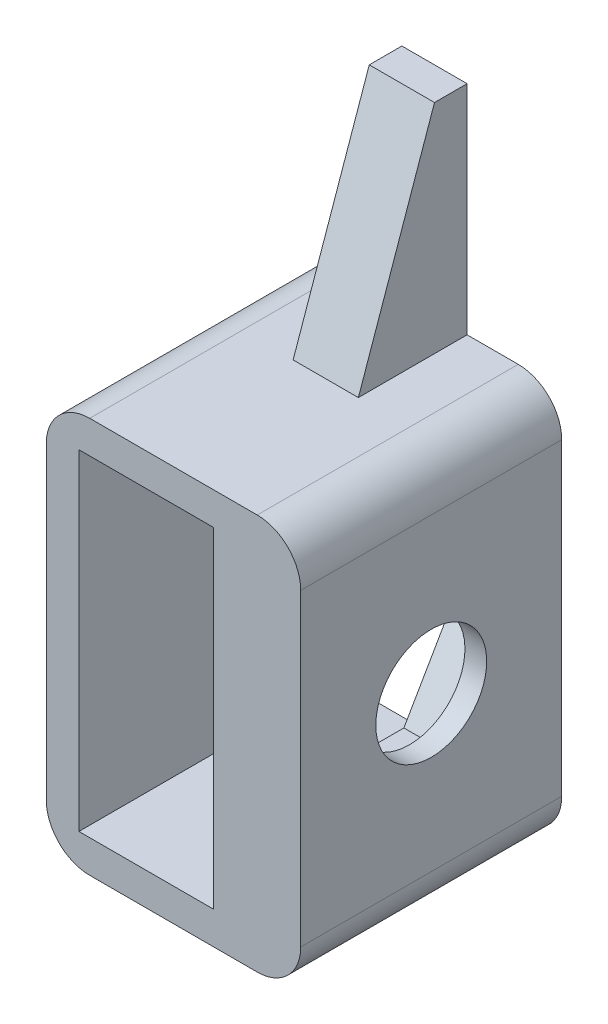
ISO-10303-21;
HEADER;
FILE_DESCRIPTION(('STEP AP214'),'2;1');
FILE_NAME('part.step','',(''),(''),'','','');
FILE_SCHEMA(('AUTOMOTIVE_DESIGN { 1 0 10303 214 1 1 1 1 }'));
ENDSEC;
DATA;
#1=APPLICATION_CONTEXT('core data for automotive mechanical design processes');
#2=APPLICATION_PROTOCOL_DEFINITION('international standard','automotive_design',2000,#1);
#3=PRODUCT_CONTEXT('',#1,'mechanical');
#4=PRODUCT('Part','Part','',(#3));
#5=PRODUCT_RELATED_PRODUCT_CATEGORY('part','',(#4));
#6=PRODUCT_DEFINITION_FORMATION('','',#4);
#7=PRODUCT_DEFINITION_CONTEXT('part definition',#1,'design');
#8=PRODUCT_DEFINITION('design','',#6,#7);
#9=PRODUCT_DEFINITION_SHAPE('','',#8);
#10=(LENGTH_UNIT() NAMED_UNIT(*) SI_UNIT(.MILLI.,.METRE.));
#11=(NAMED_UNIT(*) PLANE_ANGLE_UNIT() SI_UNIT($,.RADIAN.));
#12=(NAMED_UNIT(*) SI_UNIT($,.STERADIAN.) SOLID_ANGLE_UNIT());
#13=UNCERTAINTY_MEASURE_WITH_UNIT(LENGTH_MEASURE(1.E-05),#10,'distance_accuracy_value','');
#14=(GEOMETRIC_REPRESENTATION_CONTEXT(3) GLOBAL_UNCERTAINTY_ASSIGNED_CONTEXT((#13)) GLOBAL_UNIT_ASSIGNED_CONTEXT((#10,
#11,#12)) REPRESENTATION_CONTEXT('',''));
#15=CARTESIAN_POINT('',(0.,0.,0.));
#16=DIRECTION('',(0.,0.,1.));
#17=DIRECTION('',(1.,0.,0.));
#18=AXIS2_PLACEMENT_3D('',#15,#16,#17);
#19=CARTESIAN_POINT('',(-4.6,9.1,-12.));
#20=DIRECTION('',(0.,-1.,0.));
#21=DIRECTION('',(1.,0.,0.));
#22=AXIS2_PLACEMENT_3D('',#19,#20,#21);
#23=PLANE('',#22);
#24=DIRECTION('',(1.,0.,0.));
#25=VECTOR('',#24,1.);
#26=CARTESIAN_POINT('',(-4.6,9.1,-7.));
#27=LINE('',#26,#25);
#28=CARTESIAN_POINT('',(-0.250000000000001,9.1,-7.));
#29=VERTEX_POINT('',#28);
#30=CARTESIAN_POINT('',(2.75,9.1,-7.));
#31=VERTEX_POINT('',#30);
#32=EDGE_CURVE('E193',#29,#31,#27,.T.);
#33=ORIENTED_EDGE('',*,*,#32,.F.);
#34=DIRECTION('',(0.,0.,-1.));
#35=VECTOR('',#34,1.);
#36=CARTESIAN_POINT('',(-0.250000000000001,9.1,-12.));
#37=LINE('',#36,#35);
#38=CARTESIAN_POINT('',(-0.250000000000001,9.1,-12.));
#39=VERTEX_POINT('',#38);
#40=EDGE_CURVE('E200',#29,#39,#37,.T.);
#41=ORIENTED_EDGE('',*,*,#40,.T.);
#42=DIRECTION('',(-1.,0.,0.));
#43=VECTOR('',#42,1.);
#44=CARTESIAN_POINT('',(-4.6,9.1,-12.));
#45=LINE('',#44,#43);
#46=CARTESIAN_POINT('',(-2.6,9.1,-12.));
#47=VERTEX_POINT('',#46);
#48=EDGE_CURVE('E319',#39,#47,#45,.T.);
#49=ORIENTED_EDGE('',*,*,#48,.T.);
#50=DIRECTION('',(0.,0.,1.));
#51=VECTOR('',#50,1.);
#52=CARTESIAN_POINT('',(-2.6,9.1,-12.));
#53=LINE('',#52,#51);
#54=CARTESIAN_POINT('',(-2.6,9.1,0.));
#55=VERTEX_POINT('',#54);
#56=EDGE_CURVE('E45',#55,#47,#53,.F.);
#57=ORIENTED_EDGE('',*,*,#56,.F.);
#58=DIRECTION('',(-1.,0.,0.));
#59=VECTOR('',#58,1.);
#60=CARTESIAN_POINT('',(-4.6,9.1,0.));
#61=LINE('',#60,#59);
#62=CARTESIAN_POINT('',(5.1,9.1,0.));
#63=VERTEX_POINT('',#62);
#64=EDGE_CURVE('E313',#63,#55,#61,.T.);
#65=ORIENTED_EDGE('',*,*,#64,.F.);
#66=DIRECTION('',(0.,0.,1.));
#67=VECTOR('',#66,1.);
#68=CARTESIAN_POINT('',(5.1,9.1,-12.));
#69=LINE('',#68,#67);
#70=CARTESIAN_POINT('',(5.1,9.1,-12.));
#71=VERTEX_POINT('',#70);
#72=EDGE_CURVE('E11',#71,#63,#69,.T.);
#73=ORIENTED_EDGE('',*,*,#72,.F.);
#74=CARTESIAN_POINT('',(2.75,9.1,-12.));
#75=VERTEX_POINT('',#74);
#76=EDGE_CURVE('E320',#71,#75,#45,.T.);
#77=ORIENTED_EDGE('',*,*,#76,.T.);
#78=DIRECTION('',(0.,0.,1.));
#79=VECTOR('',#78,1.);
#80=CARTESIAN_POINT('',(2.75,9.1,-12.));
#81=LINE('',#80,#79);
#82=EDGE_CURVE('E207',#75,#31,#81,.T.);
#83=ORIENTED_EDGE('',*,*,#82,.T.);
#84=EDGE_LOOP('',(#33,#41,#49,#57,#65,#73,#77,#83));
#85=FACE_BOUND('',#84,.T.);
#86=ADVANCED_FACE('F37',(#85),#23,.F.);
#87=CARTESIAN_POINT('',(0.,0.,-12.));
#88=DIRECTION('',(0.,0.,-1.));
#89=DIRECTION('',(1.,0.,0.));
#90=AXIS2_PLACEMENT_3D('',#87,#88,#89);
#91=PLANE('',#90);
#92=DIRECTION('',(0.,1.,0.));
#93=VECTOR('',#92,1.);
#94=CARTESIAN_POINT('',(3.1,-7.6,-12.));
#95=LINE('',#94,#93);
#96=CARTESIAN_POINT('',(3.1,-7.6,-12.));
#97=VERTEX_POINT('',#96);
#98=CARTESIAN_POINT('',(3.1,7.6,-12.));
#99=VERTEX_POINT('',#98);
#100=EDGE_CURVE('E277',#97,#99,#95,.T.);
#101=ORIENTED_EDGE('',*,*,#100,.T.);
#102=DIRECTION('',(-1.,0.,0.));
#103=VECTOR('',#102,1.);
#104=CARTESIAN_POINT('',(-3.1,7.6,-12.));
#105=LINE('',#104,#103);
#106=CARTESIAN_POINT('',(-3.1,7.6,-12.));
#107=VERTEX_POINT('',#106);
#108=EDGE_CURVE('E280',#99,#107,#105,.T.);
#109=ORIENTED_EDGE('',*,*,#108,.T.);
#110=DIRECTION('',(0.,-1.,0.));
#111=VECTOR('',#110,1.);
#112=CARTESIAN_POINT('',(-3.1,-7.6,-12.));
#113=LINE('',#112,#111);
#114=CARTESIAN_POINT('',(-3.1,-7.6,-12.));
#115=VERTEX_POINT('',#114);
#116=EDGE_CURVE('E284',#107,#115,#113,.T.);
#117=ORIENTED_EDGE('',*,*,#116,.T.);
#118=DIRECTION('',(1.,0.,0.));
#119=VECTOR('',#118,1.);
#120=CARTESIAN_POINT('',(-3.1,-7.6,-12.));
#121=LINE('',#120,#119);
#122=EDGE_CURVE('E287',#115,#97,#121,.T.);
#123=ORIENTED_EDGE('',*,*,#122,.T.);
#124=EDGE_LOOP('',(#101,#109,#117,#123));
#125=FACE_BOUND('',#124,.T.);
#126=DIRECTION('',(1.,0.,0.));
#127=VECTOR('',#126,1.);
#128=CARTESIAN_POINT('',(-4.6,-9.1,-12.));
#129=LINE('',#128,#127);
#130=CARTESIAN_POINT('',(-2.6,-9.1,-12.));
#131=VERTEX_POINT('',#130);
#132=CARTESIAN_POINT('',(5.1,-9.1,-12.));
#133=VERTEX_POINT('',#132);
#134=EDGE_CURVE('E312',#131,#133,#129,.T.);
#135=ORIENTED_EDGE('',*,*,#134,.F.);
#136=CARTESIAN_POINT('',(-2.6,-7.1,-12.));
#137=DIRECTION('',(0.,0.,1.));
#138=DIRECTION('',(1.,0.,0.));
#139=AXIS2_PLACEMENT_3D('',#136,#137,#138);
#140=CIRCLE('',#139,2.);
#141=CARTESIAN_POINT('',(-4.6,-7.1,-12.));
#142=VERTEX_POINT('',#141);
#143=EDGE_CURVE('E356',#142,#131,#140,.T.);
#144=ORIENTED_EDGE('',*,*,#143,.F.);
#145=DIRECTION('',(0.,-1.,0.));
#146=VECTOR('',#145,1.);
#147=CARTESIAN_POINT('',(-4.6,9.1,-12.));
#148=LINE('',#147,#146);
#149=CARTESIAN_POINT('',(-4.6,7.1,-12.));
#150=VERTEX_POINT('',#149);
#151=EDGE_CURVE('E309',#150,#142,#148,.T.);
#152=ORIENTED_EDGE('',*,*,#151,.F.);
#153=CARTESIAN_POINT('',(-2.6,7.1,-12.));
#154=DIRECTION('',(0.,0.,1.));
#155=DIRECTION('',(1.,0.,0.));
#156=AXIS2_PLACEMENT_3D('',#153,#154,#155);
#157=CIRCLE('',#156,2.);
#158=EDGE_CURVE('E52',#47,#150,#157,.T.);
#159=ORIENTED_EDGE('',*,*,#158,.F.);
#160=ORIENTED_EDGE('',*,*,#48,.F.);
#161=DIRECTION('',(0.,-1.,0.));
#162=VECTOR('',#161,1.);
#163=CARTESIAN_POINT('',(-0.250000000000004,19.1,-12.));
#164=LINE('',#163,#162);
#165=CARTESIAN_POINT('',(-0.250000000000004,19.1,-12.));
#166=VERTEX_POINT('',#165);
#167=EDGE_CURVE('E203',#166,#39,#164,.T.);
#168=ORIENTED_EDGE('',*,*,#167,.F.);
#169=DIRECTION('',(1.,0.,0.));
#170=VECTOR('',#169,1.);
#171=CARTESIAN_POINT('',(2.75,19.1,-12.));
#172=LINE('',#171,#170);
#173=CARTESIAN_POINT('',(2.75,19.1,-12.));
#174=VERTEX_POINT('',#173);
#175=EDGE_CURVE('E221',#166,#174,#172,.T.);
#176=ORIENTED_EDGE('',*,*,#175,.T.);
#177=DIRECTION('',(0.,-1.,0.));
#178=VECTOR('',#177,1.);
#179=CARTESIAN_POINT('',(2.75,19.1,-12.));
#180=LINE('',#179,#178);
#181=EDGE_CURVE('E223',#174,#75,#180,.T.);
#182=ORIENTED_EDGE('',*,*,#181,.T.);
#183=ORIENTED_EDGE('',*,*,#76,.F.);
#184=CARTESIAN_POINT('',(5.1,7.1,-12.));
#185=DIRECTION('',(0.,0.,1.));
#186=DIRECTION('',(1.,0.,0.));
#187=AXIS2_PLACEMENT_3D('',#184,#185,#186);
#188=CIRCLE('',#187,2.);
#189=CARTESIAN_POINT('',(7.1,7.1,-12.));
#190=VERTEX_POINT('',#189);
#191=EDGE_CURVE('E59',#190,#71,#188,.T.);
#192=ORIENTED_EDGE('',*,*,#191,.F.);
#193=DIRECTION('',(0.,1.,0.));
#194=VECTOR('',#193,1.);
#195=CARTESIAN_POINT('',(7.1,9.1,-12.));
#196=LINE('',#195,#194);
#197=CARTESIAN_POINT('',(7.1,-7.1,-12.));
#198=VERTEX_POINT('',#197);
#199=EDGE_CURVE('E316',#198,#190,#196,.T.);
#200=ORIENTED_EDGE('',*,*,#199,.F.);
#201=CARTESIAN_POINT('',(5.1,-7.1,-12.));
#202=DIRECTION('',(0.,0.,1.));
#203=DIRECTION('',(1.,0.,0.));
#204=AXIS2_PLACEMENT_3D('',#201,#202,#203);
#205=CIRCLE('',#204,2.);
#206=EDGE_CURVE('E353',#133,#198,#205,.T.);
#207=ORIENTED_EDGE('',*,*,#206,.F.);
#208=EDGE_LOOP('',(#135,#144,#152,#159,#160,#168,#176,#182,#183,#192,#200,#207));
#209=FACE_BOUND('',#208,.T.);
#210=ADVANCED_FACE('F367',(#125,#209),#91,.T.);
#211=CARTESIAN_POINT('',(0.,0.,0.));
#212=DIRECTION('',(0.,0.,-1.));
#213=DIRECTION('',(1.,0.,0.));
#214=AXIS2_PLACEMENT_3D('',#211,#212,#213);
#215=PLANE('',#214);
#216=DIRECTION('',(1.,0.,0.));
#217=VECTOR('',#216,1.);
#218=CARTESIAN_POINT('',(-4.6,-9.1,0.));
#219=LINE('',#218,#217);
#220=CARTESIAN_POINT('',(-2.6,-9.1,0.));
#221=VERTEX_POINT('',#220);
#222=CARTESIAN_POINT('',(5.1,-9.1,0.));
#223=VERTEX_POINT('',#222);
#224=EDGE_CURVE('E325',#221,#223,#219,.T.);
#225=ORIENTED_EDGE('',*,*,#224,.T.);
#226=CARTESIAN_POINT('',(5.1,-7.1,0.));
#227=DIRECTION('',(0.,0.,1.));
#228=DIRECTION('',(1.,0.,0.));
#229=AXIS2_PLACEMENT_3D('',#226,#227,#228);
#230=CIRCLE('',#229,2.);
#231=CARTESIAN_POINT('',(7.1,-7.1,0.));
#232=VERTEX_POINT('',#231);
#233=EDGE_CURVE('E341',#232,#223,#230,.F.);
#234=ORIENTED_EDGE('',*,*,#233,.F.);
#235=DIRECTION('',(0.,1.,0.));
#236=VECTOR('',#235,1.);
#237=CARTESIAN_POINT('',(7.1,9.1,0.));
#238=LINE('',#237,#236);
#239=CARTESIAN_POINT('',(7.1,7.1,0.));
#240=VERTEX_POINT('',#239);
#241=EDGE_CURVE('E328',#232,#240,#238,.T.);
#242=ORIENTED_EDGE('',*,*,#241,.T.);
#243=CARTESIAN_POINT('',(5.1,7.1,0.));
#244=DIRECTION('',(0.,0.,1.));
#245=DIRECTION('',(1.,0.,0.));
#246=AXIS2_PLACEMENT_3D('',#243,#244,#245);
#247=CIRCLE('',#246,2.);
#248=EDGE_CURVE('E338',#63,#240,#247,.F.);
#249=ORIENTED_EDGE('',*,*,#248,.F.);
#250=ORIENTED_EDGE('',*,*,#64,.T.);
#251=CARTESIAN_POINT('',(-2.6,7.1,0.));
#252=DIRECTION('',(0.,0.,1.));
#253=DIRECTION('',(1.,0.,0.));
#254=AXIS2_PLACEMENT_3D('',#251,#252,#253);
#255=CIRCLE('',#254,2.);
#256=CARTESIAN_POINT('',(-4.6,7.1,0.));
#257=VERTEX_POINT('',#256);
#258=EDGE_CURVE('E336',#257,#55,#255,.F.);
#259=ORIENTED_EDGE('',*,*,#258,.F.);
#260=DIRECTION('',(0.,-1.,0.));
#261=VECTOR('',#260,1.);
#262=CARTESIAN_POINT('',(-4.6,9.1,0.));
#263=LINE('',#262,#261);
#264=CARTESIAN_POINT('',(-4.6,-7.1,0.));
#265=VERTEX_POINT('',#264);
#266=EDGE_CURVE('E308',#257,#265,#263,.T.);
#267=ORIENTED_EDGE('',*,*,#266,.T.);
#268=CARTESIAN_POINT('',(-2.6,-7.1,0.));
#269=DIRECTION('',(0.,0.,1.));
#270=DIRECTION('',(1.,0.,0.));
#271=AXIS2_PLACEMENT_3D('',#268,#269,#270);
#272=CIRCLE('',#271,2.);
#273=EDGE_CURVE('E344',#221,#265,#272,.F.);
#274=ORIENTED_EDGE('',*,*,#273,.F.);
#275=EDGE_LOOP('',(#225,#234,#242,#249,#250,#259,#267,#274));
#276=FACE_BOUND('',#275,.T.);
#277=DIRECTION('',(0.,1.,0.));
#278=VECTOR('',#277,1.);
#279=CARTESIAN_POINT('',(3.1,-7.6,0.));
#280=LINE('',#279,#278);
#281=CARTESIAN_POINT('',(3.1,-7.6,0.));
#282=VERTEX_POINT('',#281);
#283=CARTESIAN_POINT('',(3.1,7.6,0.));
#284=VERTEX_POINT('',#283);
#285=EDGE_CURVE('E267',#282,#284,#280,.T.);
#286=ORIENTED_EDGE('',*,*,#285,.F.);
#287=DIRECTION('',(1.,0.,0.));
#288=VECTOR('',#287,1.);
#289=CARTESIAN_POINT('',(-3.1,-7.6,0.));
#290=LINE('',#289,#288);
#291=CARTESIAN_POINT('',(-3.1,-7.6,0.));
#292=VERTEX_POINT('',#291);
#293=EDGE_CURVE('E281',#292,#282,#290,.T.);
#294=ORIENTED_EDGE('',*,*,#293,.F.);
#295=DIRECTION('',(0.,-1.,0.));
#296=VECTOR('',#295,1.);
#297=CARTESIAN_POINT('',(-3.1,-7.6,0.));
#298=LINE('',#297,#296);
#299=CARTESIAN_POINT('',(-3.1,7.6,0.));
#300=VERTEX_POINT('',#299);
#301=EDGE_CURVE('E296',#300,#292,#298,.T.);
#302=ORIENTED_EDGE('',*,*,#301,.F.);
#303=DIRECTION('',(-1.,0.,0.));
#304=VECTOR('',#303,1.);
#305=CARTESIAN_POINT('',(-3.1,7.6,0.));
#306=LINE('',#305,#304);
#307=EDGE_CURVE('E293',#284,#300,#306,.T.);
#308=ORIENTED_EDGE('',*,*,#307,.F.);
#309=EDGE_LOOP('',(#286,#294,#302,#308));
#310=FACE_BOUND('',#309,.T.);
#311=ADVANCED_FACE('F394',(#276,#310),#215,.F.);
#312=CARTESIAN_POINT('',(-4.6,9.1,-12.));
#313=DIRECTION('',(1.,0.,0.));
#314=DIRECTION('',(0.,1.,0.));
#315=AXIS2_PLACEMENT_3D('',#312,#313,#314);
#316=PLANE('',#315);
#317=ORIENTED_EDGE('',*,*,#266,.F.);
#318=DIRECTION('',(0.,0.,1.));
#319=VECTOR('',#318,1.);
#320=CARTESIAN_POINT('',(-4.6,7.1,-12.));
#321=LINE('',#320,#319);
#322=EDGE_CURVE('E347',#150,#257,#321,.T.);
#323=ORIENTED_EDGE('',*,*,#322,.F.);
#324=ORIENTED_EDGE('',*,*,#151,.T.);
#325=DIRECTION('',(0.,0.,1.));
#326=VECTOR('',#325,1.);
#327=CARTESIAN_POINT('',(-4.6,-7.1,-12.));
#328=LINE('',#327,#326);
#329=EDGE_CURVE('E349',#265,#142,#328,.F.);
#330=ORIENTED_EDGE('',*,*,#329,.F.);
#331=EDGE_LOOP('',(#317,#323,#324,#330));
#332=FACE_BOUND('',#331,.T.);
#333=ADVANCED_FACE('F392',(#332),#316,.F.);
#334=CARTESIAN_POINT('',(-4.6,-9.1,-12.));
#335=DIRECTION('',(0.,1.,0.));
#336=DIRECTION('',(0.,0.,-1.));
#337=AXIS2_PLACEMENT_3D('',#334,#335,#336);
#338=PLANE('',#337);
#339=DIRECTION('',(0.,0.,1.));
#340=VECTOR('',#339,1.);
#341=CARTESIAN_POINT('',(5.1,-9.1,-12.));
#342=LINE('',#341,#340);
#343=EDGE_CURVE('E322',#223,#133,#342,.F.);
#344=ORIENTED_EDGE('',*,*,#343,.F.);
#345=ORIENTED_EDGE('',*,*,#224,.F.);
#346=DIRECTION('',(0.,0.,1.));
#347=VECTOR('',#346,1.);
#348=CARTESIAN_POINT('',(-2.6,-9.1,-12.));
#349=LINE('',#348,#347);
#350=EDGE_CURVE('E334',#131,#221,#349,.T.);
#351=ORIENTED_EDGE('',*,*,#350,.F.);
#352=ORIENTED_EDGE('',*,*,#134,.T.);
#353=EDGE_LOOP('',(#344,#345,#351,#352));
#354=FACE_BOUND('',#353,.T.);
#355=ADVANCED_FACE('F385',(#354),#338,.F.);
#356=CARTESIAN_POINT('',(7.1,9.1,-12.));
#357=DIRECTION('',(-1.,0.,0.));
#358=DIRECTION('',(0.,-1.,0.));
#359=AXIS2_PLACEMENT_3D('',#356,#357,#358);
#360=PLANE('',#359);
#361=CARTESIAN_POINT('',(7.1,0.,-6.));
#362=DIRECTION('',(1.,0.,0.));
#363=DIRECTION('',(0.,-1.,0.));
#364=AXIS2_PLACEMENT_3D('',#361,#362,#363);
#365=CIRCLE('',#364,2.55);
#366=CARTESIAN_POINT('',(7.1,-2.55,-6.));
#367=VERTEX_POINT('',#366);
#368=EDGE_CURVE('E227',#367,#367,#365,.T.);
#369=ORIENTED_EDGE('',*,*,#368,.F.);
#370=EDGE_LOOP('',(#369));
#371=FACE_BOUND('',#370,.T.);
#372=ORIENTED_EDGE('',*,*,#199,.T.);
#373=DIRECTION('',(0.,0.,1.));
#374=VECTOR('',#373,1.);
#375=CARTESIAN_POINT('',(7.1,7.1,-12.));
#376=LINE('',#375,#374);
#377=EDGE_CURVE('E359',#240,#190,#376,.F.);
#378=ORIENTED_EDGE('',*,*,#377,.F.);
#379=ORIENTED_EDGE('',*,*,#241,.F.);
#380=DIRECTION('',(0.,0.,1.));
#381=VECTOR('',#380,1.);
#382=CARTESIAN_POINT('',(7.1,-7.1,-12.));
#383=LINE('',#382,#381);
#384=EDGE_CURVE('E361',#198,#232,#383,.T.);
#385=ORIENTED_EDGE('',*,*,#384,.F.);
#386=EDGE_LOOP('',(#372,#378,#379,#385));
#387=FACE_BOUND('',#386,.T.);
#388=ADVANCED_FACE('F378',(#371,#387),#360,.F.);
#389=CARTESIAN_POINT('',(3.1,-7.6,-12.));
#390=DIRECTION('',(-1.,0.,0.));
#391=DIRECTION('',(0.,-1.,0.));
#392=AXIS2_PLACEMENT_3D('',#389,#390,#391);
#393=PLANE('',#392);
#394=DIRECTION('',(0.,-0.866025403784439,0.5));
#395=VECTOR('',#394,1.);
#396=CARTESIAN_POINT('',(3.1,4.75,-3.25758622134927));
#397=LINE('',#396,#395);
#398=CARTESIAN_POINT('',(3.1,4.75,-3.25758622134927));
#399=VERTEX_POINT('',#398);
#400=CARTESIAN_POINT('',(3.1,0.,-0.515172442698557));
#401=VERTEX_POINT('',#400);
#402=EDGE_CURVE('E233',#399,#401,#397,.T.);
#403=ORIENTED_EDGE('',*,*,#402,.T.);
#404=DIRECTION('',(0.,-0.866025403784439,-0.5));
#405=VECTOR('',#404,1.);
#406=CARTESIAN_POINT('',(3.1,0.,-0.515172442698555));
#407=LINE('',#406,#405);
#408=CARTESIAN_POINT('',(3.1,-4.75,-3.25758622134928));
#409=VERTEX_POINT('',#408);
#410=EDGE_CURVE('E251',#401,#409,#407,.T.);
#411=ORIENTED_EDGE('',*,*,#410,.T.);
#412=DIRECTION('',(0.,0.,-1.));
#413=VECTOR('',#412,1.);
#414=CARTESIAN_POINT('',(3.1,-4.75,-3.25758622134928));
#415=LINE('',#414,#413);
#416=CARTESIAN_POINT('',(3.1,-4.75,-8.74241377865072));
#417=VERTEX_POINT('',#416);
#418=EDGE_CURVE('E254',#409,#417,#415,.T.);
#419=ORIENTED_EDGE('',*,*,#418,.T.);
#420=DIRECTION('',(0.,0.866025403784439,-0.5));
#421=VECTOR('',#420,1.);
#422=CARTESIAN_POINT('',(3.1,-4.75,-8.74241377865072));
#423=LINE('',#422,#421);
#424=CARTESIAN_POINT('',(3.1,0.,-11.4848275573014));
#425=VERTEX_POINT('',#424);
#426=EDGE_CURVE('E257',#417,#425,#423,.T.);
#427=ORIENTED_EDGE('',*,*,#426,.T.);
#428=DIRECTION('',(0.,0.866025403784439,0.5));
#429=VECTOR('',#428,1.);
#430=CARTESIAN_POINT('',(3.1,0.,-11.4848275573014));
#431=LINE('',#430,#429);
#432=CARTESIAN_POINT('',(3.1,4.75,-8.74241377865072));
#433=VERTEX_POINT('',#432);
#434=EDGE_CURVE('E260',#425,#433,#431,.T.);
#435=ORIENTED_EDGE('',*,*,#434,.T.);
#436=DIRECTION('',(0.,0.,1.));
#437=VECTOR('',#436,1.);
#438=CARTESIAN_POINT('',(3.1,4.75,-8.74241377865072));
#439=LINE('',#438,#437);
#440=EDGE_CURVE('E238',#433,#399,#439,.T.);
#441=ORIENTED_EDGE('',*,*,#440,.T.);
#442=EDGE_LOOP('',(#403,#411,#419,#427,#435,#441));
#443=FACE_BOUND('',#442,.T.);
#444=ORIENTED_EDGE('',*,*,#285,.T.);
#445=DIRECTION('',(0.,0.,1.));
#446=VECTOR('',#445,1.);
#447=CARTESIAN_POINT('',(3.1,7.6,-12.));
#448=LINE('',#447,#446);
#449=EDGE_CURVE('E306',#99,#284,#448,.T.);
#450=ORIENTED_EDGE('',*,*,#449,.F.);
#451=ORIENTED_EDGE('',*,*,#100,.F.);
#452=DIRECTION('',(0.,0.,1.));
#453=VECTOR('',#452,1.);
#454=CARTESIAN_POINT('',(3.1,-7.6,-12.));
#455=LINE('',#454,#453);
#456=EDGE_CURVE('E290',#97,#282,#455,.T.);
#457=ORIENTED_EDGE('',*,*,#456,.T.);
#458=EDGE_LOOP('',(#444,#450,#451,#457));
#459=FACE_BOUND('',#458,.T.);
#460=ADVANCED_FACE('F414',(#443,#459),#393,.T.);
#461=CARTESIAN_POINT('',(-3.1,7.6,-12.));
#462=DIRECTION('',(0.,-1.,0.));
#463=DIRECTION('',(0.,0.,1.));
#464=AXIS2_PLACEMENT_3D('',#461,#462,#463);
#465=PLANE('',#464);
#466=ORIENTED_EDGE('',*,*,#108,.F.);
#467=ORIENTED_EDGE('',*,*,#449,.T.);
#468=ORIENTED_EDGE('',*,*,#307,.T.);
#469=DIRECTION('',(0.,0.,1.));
#470=VECTOR('',#469,1.);
#471=CARTESIAN_POINT('',(-3.1,7.6,-12.));
#472=LINE('',#471,#470);
#473=EDGE_CURVE('E304',#107,#300,#472,.T.);
#474=ORIENTED_EDGE('',*,*,#473,.F.);
#475=EDGE_LOOP('',(#466,#467,#468,#474));
#476=FACE_BOUND('',#475,.T.);
#477=ADVANCED_FACE('F472',(#476),#465,.T.);
#478=CARTESIAN_POINT('',(-3.1,-7.6,-12.));
#479=DIRECTION('',(1.,0.,0.));
#480=DIRECTION('',(0.,1.,0.));
#481=AXIS2_PLACEMENT_3D('',#478,#479,#480);
#482=PLANE('',#481);
#483=ORIENTED_EDGE('',*,*,#301,.T.);
#484=DIRECTION('',(0.,0.,1.));
#485=VECTOR('',#484,1.);
#486=CARTESIAN_POINT('',(-3.1,-7.6,-12.));
#487=LINE('',#486,#485);
#488=EDGE_CURVE('E302',#115,#292,#487,.T.);
#489=ORIENTED_EDGE('',*,*,#488,.F.);
#490=ORIENTED_EDGE('',*,*,#116,.F.);
#491=ORIENTED_EDGE('',*,*,#473,.T.);
#492=EDGE_LOOP('',(#483,#489,#490,#491));
#493=FACE_BOUND('',#492,.T.);
#494=ADVANCED_FACE('F468',(#493),#482,.T.);
#495=CARTESIAN_POINT('',(-3.1,-7.6,-12.));
#496=DIRECTION('',(0.,1.,0.));
#497=DIRECTION('',(0.,0.,-1.));
#498=AXIS2_PLACEMENT_3D('',#495,#496,#497);
#499=PLANE('',#498);
#500=ORIENTED_EDGE('',*,*,#122,.F.);
#501=ORIENTED_EDGE('',*,*,#488,.T.);
#502=ORIENTED_EDGE('',*,*,#293,.T.);
#503=ORIENTED_EDGE('',*,*,#456,.F.);
#504=EDGE_LOOP('',(#500,#501,#502,#503));
#505=FACE_BOUND('',#504,.T.);
#506=ADVANCED_FACE('F464',(#505),#499,.T.);
#507=CARTESIAN_POINT('',(6.1,4.75,-3.25758622134927));
#508=DIRECTION('',(0.,0.5,0.866025403784439));
#509=DIRECTION('',(0.,0.866025403784439,-0.5));
#510=AXIS2_PLACEMENT_3D('',#507,#508,#509);
#511=PLANE('',#510);
#512=ORIENTED_EDGE('',*,*,#402,.F.);
#513=DIRECTION('',(-1.,0.,0.));
#514=VECTOR('',#513,1.);
#515=CARTESIAN_POINT('',(6.1,4.75,-3.25758622134927));
#516=LINE('',#515,#514);
#517=CARTESIAN_POINT('',(6.1,4.75,-3.25758622134927));
#518=VERTEX_POINT('',#517);
#519=EDGE_CURVE('E265',#518,#399,#516,.T.);
#520=ORIENTED_EDGE('',*,*,#519,.F.);
#521=DIRECTION('',(0.,-0.866025403784439,0.5));
#522=VECTOR('',#521,1.);
#523=CARTESIAN_POINT('',(6.1,4.75,-3.25758622134927));
#524=LINE('',#523,#522);
#525=CARTESIAN_POINT('',(6.1,0.,-0.515172442698555));
#526=VERTEX_POINT('',#525);
#527=EDGE_CURVE('E234',#518,#526,#524,.T.);
#528=ORIENTED_EDGE('',*,*,#527,.T.);
#529=DIRECTION('',(-1.,0.,0.));
#530=VECTOR('',#529,1.);
#531=CARTESIAN_POINT('',(6.1,0.,-0.515172442698555));
#532=LINE('',#531,#530);
#533=EDGE_CURVE('E248',#526,#401,#532,.T.);
#534=ORIENTED_EDGE('',*,*,#533,.T.);
#535=EDGE_LOOP('',(#512,#520,#528,#534));
#536=FACE_BOUND('',#535,.T.);
#537=ADVANCED_FACE('F446',(#536),#511,.F.);
#538=CARTESIAN_POINT('',(6.1,4.75,-8.74241377865072));
#539=DIRECTION('',(0.,1.,0.));
#540=DIRECTION('',(-1.,0.,0.));
#541=AXIS2_PLACEMENT_3D('',#538,#539,#540);
#542=PLANE('',#541);
#543=ORIENTED_EDGE('',*,*,#440,.F.);
#544=DIRECTION('',(-1.,0.,0.));
#545=VECTOR('',#544,1.);
#546=CARTESIAN_POINT('',(6.1,4.75,-8.74241377865072));
#547=LINE('',#546,#545);
#548=CARTESIAN_POINT('',(6.1,4.75,-8.74241377865072));
#549=VERTEX_POINT('',#548);
#550=EDGE_CURVE('E268',#549,#433,#547,.T.);
#551=ORIENTED_EDGE('',*,*,#550,.F.);
#552=DIRECTION('',(0.,0.,1.));
#553=VECTOR('',#552,1.);
#554=CARTESIAN_POINT('',(6.1,4.75,-8.74241377865072));
#555=LINE('',#554,#553);
#556=EDGE_CURVE('E246',#549,#518,#555,.T.);
#557=ORIENTED_EDGE('',*,*,#556,.T.);
#558=ORIENTED_EDGE('',*,*,#519,.T.);
#559=EDGE_LOOP('',(#543,#551,#557,#558));
#560=FACE_BOUND('',#559,.T.);
#561=ADVANCED_FACE('F442',(#560),#542,.F.);
#562=CARTESIAN_POINT('',(6.1,0.,-11.4848275573014));
#563=DIRECTION('',(0.,0.5,-0.866025403784438));
#564=DIRECTION('',(0.,-0.866025403784439,-0.5));
#565=AXIS2_PLACEMENT_3D('',#562,#563,#564);
#566=PLANE('',#565);
#567=ORIENTED_EDGE('',*,*,#434,.F.);
#568=DIRECTION('',(-1.,0.,0.));
#569=VECTOR('',#568,1.);
#570=CARTESIAN_POINT('',(6.1,0.,-11.4848275573014));
#571=LINE('',#570,#569);
#572=CARTESIAN_POINT('',(6.1,0.,-11.4848275573014));
#573=VERTEX_POINT('',#572);
#574=EDGE_CURVE('E270',#573,#425,#571,.T.);
#575=ORIENTED_EDGE('',*,*,#574,.F.);
#576=DIRECTION('',(0.,0.866025403784439,0.5));
#577=VECTOR('',#576,1.);
#578=CARTESIAN_POINT('',(6.1,0.,-11.4848275573014));
#579=LINE('',#578,#577);
#580=EDGE_CURVE('E244',#573,#549,#579,.T.);
#581=ORIENTED_EDGE('',*,*,#580,.T.);
#582=ORIENTED_EDGE('',*,*,#550,.T.);
#583=EDGE_LOOP('',(#567,#575,#581,#582));
#584=FACE_BOUND('',#583,.T.);
#585=ADVANCED_FACE('F445',(#584),#566,.F.);
#586=CARTESIAN_POINT('',(6.1,-4.75,-8.74241377865072));
#587=DIRECTION('',(0.,-0.5,-0.866025403784439));
#588=DIRECTION('',(0.,-0.866025403784439,0.5));
#589=AXIS2_PLACEMENT_3D('',#586,#587,#588);
#590=PLANE('',#589);
#591=ORIENTED_EDGE('',*,*,#426,.F.);
#592=DIRECTION('',(-1.,0.,0.));
#593=VECTOR('',#592,1.);
#594=CARTESIAN_POINT('',(6.1,-4.75,-8.74241377865072));
#595=LINE('',#594,#593);
#596=CARTESIAN_POINT('',(6.1,-4.75,-8.74241377865072));
#597=VERTEX_POINT('',#596);
#598=EDGE_CURVE('E272',#597,#417,#595,.T.);
#599=ORIENTED_EDGE('',*,*,#598,.F.);
#600=DIRECTION('',(0.,0.866025403784439,-0.5));
#601=VECTOR('',#600,1.);
#602=CARTESIAN_POINT('',(6.1,-4.75,-8.74241377865072));
#603=LINE('',#602,#601);
#604=EDGE_CURVE('E242',#597,#573,#603,.T.);
#605=ORIENTED_EDGE('',*,*,#604,.T.);
#606=ORIENTED_EDGE('',*,*,#574,.T.);
#607=EDGE_LOOP('',(#591,#599,#605,#606));
#608=FACE_BOUND('',#607,.T.);
#609=ADVANCED_FACE('F450',(#608),#590,.F.);
#610=CARTESIAN_POINT('',(6.1,-4.75,-3.25758622134928));
#611=DIRECTION('',(0.,-1.,0.));
#612=DIRECTION('',(0.,0.,1.));
#613=AXIS2_PLACEMENT_3D('',#610,#611,#612);
#614=PLANE('',#613);
#615=ORIENTED_EDGE('',*,*,#418,.F.);
#616=DIRECTION('',(-1.,0.,0.));
#617=VECTOR('',#616,1.);
#618=CARTESIAN_POINT('',(6.1,-4.75,-3.25758622134928));
#619=LINE('',#618,#617);
#620=CARTESIAN_POINT('',(6.1,-4.75,-3.25758622134928));
#621=VERTEX_POINT('',#620);
#622=EDGE_CURVE('E274',#621,#409,#619,.T.);
#623=ORIENTED_EDGE('',*,*,#622,.F.);
#624=DIRECTION('',(0.,0.,-1.));
#625=VECTOR('',#624,1.);
#626=CARTESIAN_POINT('',(6.1,-4.75,-3.25758622134928));
#627=LINE('',#626,#625);
#628=EDGE_CURVE('E240',#621,#597,#627,.T.);
#629=ORIENTED_EDGE('',*,*,#628,.T.);
#630=ORIENTED_EDGE('',*,*,#598,.T.);
#631=EDGE_LOOP('',(#615,#623,#629,#630));
#632=FACE_BOUND('',#631,.T.);
#633=ADVANCED_FACE('F454',(#632),#614,.F.);
#634=CARTESIAN_POINT('',(6.1,0.,-0.515172442698555));
#635=DIRECTION('',(0.,-0.5,0.866025403784439));
#636=DIRECTION('',(0.,0.866025403784439,0.5));
#637=AXIS2_PLACEMENT_3D('',#634,#635,#636);
#638=PLANE('',#637);
#639=ORIENTED_EDGE('',*,*,#410,.F.);
#640=ORIENTED_EDGE('',*,*,#533,.F.);
#641=DIRECTION('',(0.,-0.866025403784439,-0.5));
#642=VECTOR('',#641,1.);
#643=CARTESIAN_POINT('',(6.1,0.,-0.515172442698555));
#644=LINE('',#643,#642);
#645=EDGE_CURVE('E237',#526,#621,#644,.T.);
#646=ORIENTED_EDGE('',*,*,#645,.T.);
#647=ORIENTED_EDGE('',*,*,#622,.T.);
#648=EDGE_LOOP('',(#639,#640,#646,#647));
#649=FACE_BOUND('',#648,.T.);
#650=ADVANCED_FACE('F440',(#649),#638,.F.);
#651=CARTESIAN_POINT('',(6.1,0.,0.));
#652=DIRECTION('',(-1.,0.,0.));
#653=DIRECTION('',(0.,-1.,0.));
#654=AXIS2_PLACEMENT_3D('',#651,#652,#653);
#655=PLANE('',#654);
#656=CARTESIAN_POINT('',(6.1,0.,-6.));
#657=DIRECTION('',(1.,0.,0.));
#658=DIRECTION('',(0.,-1.,0.));
#659=AXIS2_PLACEMENT_3D('',#656,#657,#658);
#660=CIRCLE('',#659,2.55);
#661=CARTESIAN_POINT('',(6.1,-2.55,-6.));
#662=VERTEX_POINT('',#661);
#663=EDGE_CURVE('E230',#662,#662,#660,.T.);
#664=ORIENTED_EDGE('',*,*,#663,.T.);
#665=EDGE_LOOP('',(#664));
#666=FACE_BOUND('',#665,.T.);
#667=ORIENTED_EDGE('',*,*,#527,.F.);
#668=ORIENTED_EDGE('',*,*,#556,.F.);
#669=ORIENTED_EDGE('',*,*,#580,.F.);
#670=ORIENTED_EDGE('',*,*,#604,.F.);
#671=ORIENTED_EDGE('',*,*,#628,.F.);
#672=ORIENTED_EDGE('',*,*,#645,.F.);
#673=EDGE_LOOP('',(#667,#668,#669,#670,#671,#672));
#674=FACE_BOUND('',#673,.T.);
#675=ADVANCED_FACE('F436',(#666,#674),#655,.T.);
#676=CARTESIAN_POINT('',(7.1,0.,-6.));
#677=DIRECTION('',(-1.,0.,0.));
#678=DIRECTION('',(0.,-1.,0.));
#679=AXIS2_PLACEMENT_3D('',#676,#677,#678);
#680=CYLINDRICAL_SURFACE('',#679,2.55);
#681=ORIENTED_EDGE('',*,*,#663,.F.);
#682=EDGE_LOOP('',(#681));
#683=FACE_BOUND('',#682,.T.);
#684=ORIENTED_EDGE('',*,*,#368,.T.);
#685=EDGE_LOOP('',(#684));
#686=FACE_BOUND('',#685,.T.);
#687=ADVANCED_FACE('F433',(#683,#686),#680,.F.);
#688=CARTESIAN_POINT('',(2.75,19.1,-12.));
#689=DIRECTION('',(-1.,0.,0.));
#690=DIRECTION('',(0.,-1.,0.));
#691=AXIS2_PLACEMENT_3D('',#688,#689,#690);
#692=PLANE('',#691);
#693=ORIENTED_EDGE('',*,*,#181,.F.);
#694=DIRECTION('',(0.,0.,1.));
#695=VECTOR('',#694,1.);
#696=CARTESIAN_POINT('',(2.75,19.1,-12.));
#697=LINE('',#696,#695);
#698=CARTESIAN_POINT('',(2.75,19.1,-10.5));
#699=VERTEX_POINT('',#698);
#700=EDGE_CURVE('E206',#174,#699,#697,.T.);
#701=ORIENTED_EDGE('',*,*,#700,.T.);
#702=DIRECTION('',(0.,0.943858356366017,-0.330350424728106));
#703=VECTOR('',#702,1.);
#704=CARTESIAN_POINT('',(2.75,9.1,-7.));
#705=LINE('',#704,#703);
#706=EDGE_CURVE('E197',#31,#699,#705,.T.);
#707=ORIENTED_EDGE('',*,*,#706,.F.);
#708=ORIENTED_EDGE('',*,*,#82,.F.);
#709=EDGE_LOOP('',(#693,#701,#707,#708));
#710=FACE_BOUND('',#709,.T.);
#711=ADVANCED_FACE('F373',(#710),#692,.F.);
#712=CARTESIAN_POINT('',(-0.250000000000004,19.1,-12.));
#713=DIRECTION('',(1.,0.,0.));
#714=DIRECTION('',(0.,1.,0.));
#715=AXIS2_PLACEMENT_3D('',#712,#713,#714);
#716=PLANE('',#715);
#717=ORIENTED_EDGE('',*,*,#40,.F.);
#718=DIRECTION('',(0.,0.943858356366017,-0.330350424728106));
#719=VECTOR('',#718,1.);
#720=CARTESIAN_POINT('',(-0.250000000000001,9.1,-7.));
#721=LINE('',#720,#719);
#722=CARTESIAN_POINT('',(-0.250000000000004,19.1,-10.5));
#723=VERTEX_POINT('',#722);
#724=EDGE_CURVE('E188',#29,#723,#721,.T.);
#725=ORIENTED_EDGE('',*,*,#724,.T.);
#726=DIRECTION('',(0.,0.,-1.));
#727=VECTOR('',#726,1.);
#728=CARTESIAN_POINT('',(-0.250000000000004,19.1,-12.));
#729=LINE('',#728,#727);
#730=EDGE_CURVE('E219',#723,#166,#729,.T.);
#731=ORIENTED_EDGE('',*,*,#730,.T.);
#732=ORIENTED_EDGE('',*,*,#167,.T.);
#733=EDGE_LOOP('',(#717,#725,#731,#732));
#734=FACE_BOUND('',#733,.T.);
#735=ADVANCED_FACE('F201',(#734),#716,.F.);
#736=CARTESIAN_POINT('',(0.,19.1,0.));
#737=DIRECTION('',(0.,1.,0.));
#738=DIRECTION('',(0.,0.,-1.));
#739=AXIS2_PLACEMENT_3D('',#736,#737,#738);
#740=PLANE('',#739);
#741=ORIENTED_EDGE('',*,*,#700,.F.);
#742=ORIENTED_EDGE('',*,*,#175,.F.);
#743=ORIENTED_EDGE('',*,*,#730,.F.);
#744=DIRECTION('',(-1.,0.,0.));
#745=VECTOR('',#744,1.);
#746=CARTESIAN_POINT('',(2.75,19.1,-10.5));
#747=LINE('',#746,#745);
#748=EDGE_CURVE('E194',#699,#723,#747,.T.);
#749=ORIENTED_EDGE('',*,*,#748,.F.);
#750=EDGE_LOOP('',(#741,#742,#743,#749));
#751=FACE_BOUND('',#750,.T.);
#752=ADVANCED_FACE('F371',(#751),#740,.T.);
#753=CARTESIAN_POINT('',(-2.6,-7.1,-12.));
#754=DIRECTION('',(0.,0.,1.));
#755=DIRECTION('',(-1.,0.,0.));
#756=AXIS2_PLACEMENT_3D('',#753,#754,#755);
#757=CYLINDRICAL_SURFACE('',#756,2.);
#758=ORIENTED_EDGE('',*,*,#143,.T.);
#759=ORIENTED_EDGE('',*,*,#350,.T.);
#760=ORIENTED_EDGE('',*,*,#273,.T.);
#761=ORIENTED_EDGE('',*,*,#329,.T.);
#762=EDGE_LOOP('',(#758,#759,#760,#761));
#763=FACE_BOUND('',#762,.T.);
#764=ADVANCED_FACE('F388',(#763),#757,.T.);
#765=CARTESIAN_POINT('',(5.1,-7.1,-12.));
#766=DIRECTION('',(0.,0.,1.));
#767=DIRECTION('',(-1.,0.,0.));
#768=AXIS2_PLACEMENT_3D('',#765,#766,#767);
#769=CYLINDRICAL_SURFACE('',#768,2.);
#770=ORIENTED_EDGE('',*,*,#206,.T.);
#771=ORIENTED_EDGE('',*,*,#384,.T.);
#772=ORIENTED_EDGE('',*,*,#233,.T.);
#773=ORIENTED_EDGE('',*,*,#343,.T.);
#774=EDGE_LOOP('',(#770,#771,#772,#773));
#775=FACE_BOUND('',#774,.T.);
#776=ADVANCED_FACE('F382',(#775),#769,.T.);
#777=CARTESIAN_POINT('',(5.1,7.1,-12.));
#778=DIRECTION('',(0.,0.,1.));
#779=DIRECTION('',(-1.,0.,0.));
#780=AXIS2_PLACEMENT_3D('',#777,#778,#779);
#781=CYLINDRICAL_SURFACE('',#780,2.);
#782=ORIENTED_EDGE('',*,*,#191,.T.);
#783=ORIENTED_EDGE('',*,*,#72,.T.);
#784=ORIENTED_EDGE('',*,*,#248,.T.);
#785=ORIENTED_EDGE('',*,*,#377,.T.);
#786=EDGE_LOOP('',(#782,#783,#784,#785));
#787=FACE_BOUND('',#786,.T.);
#788=ADVANCED_FACE('F396',(#787),#781,.T.);
#789=CARTESIAN_POINT('',(-2.6,7.1,-12.));
#790=DIRECTION('',(0.,0.,1.));
#791=DIRECTION('',(-1.,0.,0.));
#792=AXIS2_PLACEMENT_3D('',#789,#790,#791);
#793=CYLINDRICAL_SURFACE('',#792,2.);
#794=ORIENTED_EDGE('',*,*,#158,.T.);
#795=ORIENTED_EDGE('',*,*,#322,.T.);
#796=ORIENTED_EDGE('',*,*,#258,.T.);
#797=ORIENTED_EDGE('',*,*,#56,.T.);
#798=EDGE_LOOP('',(#794,#795,#796,#797));
#799=FACE_BOUND('',#798,.T.);
#800=ADVANCED_FACE('F39',(#799),#793,.T.);
#801=CARTESIAN_POINT('',(1.25,9.1,-7.));
#802=DIRECTION('',(0.,0.330350424728106,0.943858356366017));
#803=DIRECTION('',(0.,0.943858356366017,-0.330350424728106));
#804=AXIS2_PLACEMENT_3D('',#801,#802,#803);
#805=PLANE('',#804);
#806=ORIENTED_EDGE('',*,*,#32,.T.);
#807=ORIENTED_EDGE('',*,*,#706,.T.);
#808=ORIENTED_EDGE('',*,*,#748,.T.);
#809=ORIENTED_EDGE('',*,*,#724,.F.);
#810=EDGE_LOOP('',(#806,#807,#808,#809));
#811=FACE_BOUND('',#810,.T.);
#812=ADVANCED_FACE('F190',(#811),#805,.T.);
#813=CLOSED_SHELL('',(#86,#210,#311,#333,#355,#388,#460,#477,#494,#506,#537,#561,#585,#609,#633,
#650,#675,#687,#711,#735,#752,#764,#776,#788,#800,#812));
#814=MANIFOLD_SOLID_BREP('B2',#813);
#815=ADVANCED_BREP_SHAPE_REPRESENTATION('',(#18,#814),#14);
#816=SHAPE_DEFINITION_REPRESENTATION(#9,#815);
ENDSEC;
END-ISO-10303-21;
